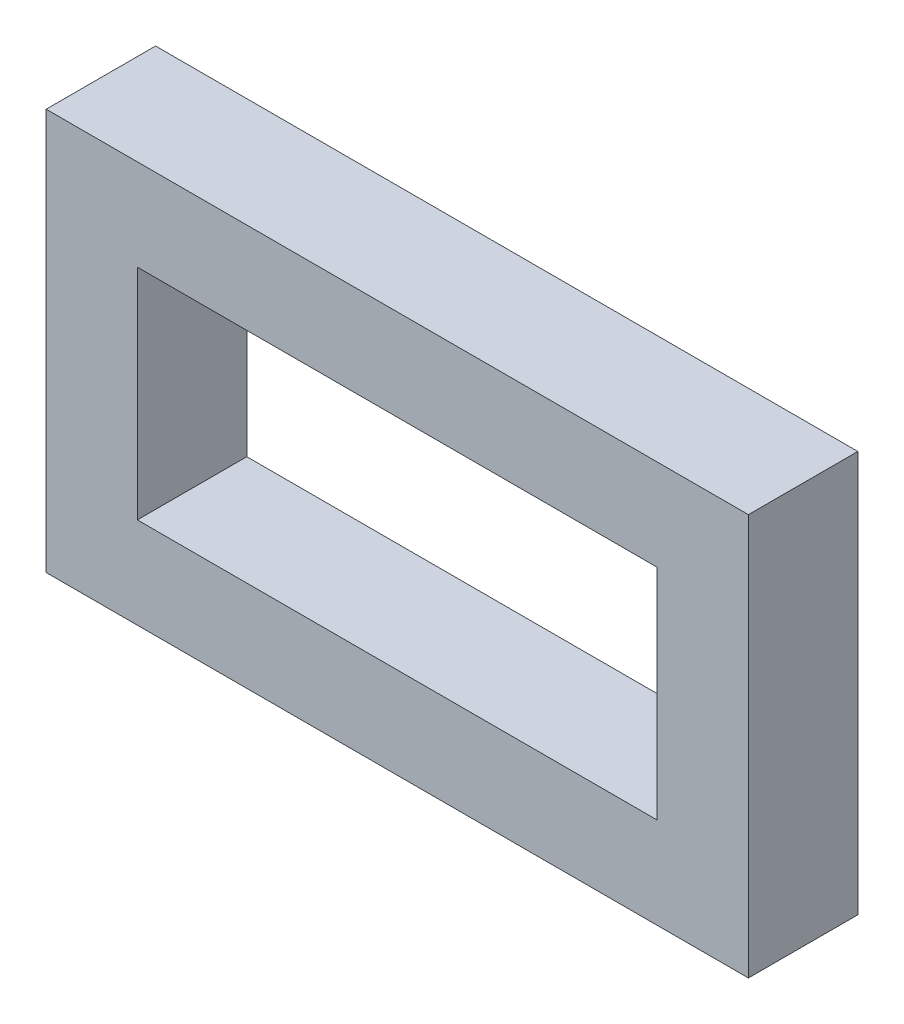
ISO-10303-21;
HEADER;
FILE_DESCRIPTION(('STEP AP214'),'2;1');
FILE_NAME('part.step','',(''),(''),'','','');
FILE_SCHEMA(('AUTOMOTIVE_DESIGN { 1 0 10303 214 1 1 1 1 }'));
ENDSEC;
DATA;
#1=APPLICATION_CONTEXT('core data for automotive mechanical design processes');
#2=APPLICATION_PROTOCOL_DEFINITION('international standard','automotive_design',2000,#1);
#3=PRODUCT_CONTEXT('',#1,'mechanical');
#4=PRODUCT('Part','Part','',(#3));
#5=PRODUCT_RELATED_PRODUCT_CATEGORY('part','',(#4));
#6=PRODUCT_DEFINITION_FORMATION('','',#4);
#7=PRODUCT_DEFINITION_CONTEXT('part definition',#1,'design');
#8=PRODUCT_DEFINITION('design','',#6,#7);
#9=PRODUCT_DEFINITION_SHAPE('','',#8);
#10=(LENGTH_UNIT() NAMED_UNIT(*) SI_UNIT(.MILLI.,.METRE.));
#11=(NAMED_UNIT(*) PLANE_ANGLE_UNIT() SI_UNIT($,.RADIAN.));
#12=(NAMED_UNIT(*) SI_UNIT($,.STERADIAN.) SOLID_ANGLE_UNIT());
#13=UNCERTAINTY_MEASURE_WITH_UNIT(LENGTH_MEASURE(1.E-05),#10,'distance_accuracy_value','');
#14=(GEOMETRIC_REPRESENTATION_CONTEXT(3) GLOBAL_UNCERTAINTY_ASSIGNED_CONTEXT((#13)) GLOBAL_UNIT_ASSIGNED_CONTEXT((#10,
#11,#12)) REPRESENTATION_CONTEXT('',''));
#15=CARTESIAN_POINT('',(0.,0.,0.));
#16=DIRECTION('',(0.,0.,1.));
#17=DIRECTION('',(1.,0.,0.));
#18=AXIS2_PLACEMENT_3D('',#15,#16,#17);
#19=CARTESIAN_POINT('',(0.,0.,6.));
#20=DIRECTION('',(0.,0.,1.));
#21=DIRECTION('',(1.,0.,0.));
#22=AXIS2_PLACEMENT_3D('',#19,#20,#21);
#23=PLANE('',#22);
#24=DIRECTION('',(0.,1.,0.));
#25=VECTOR('',#24,1.);
#26=CARTESIAN_POINT('',(19.25,11.,6.));
#27=LINE('',#26,#25);
#28=CARTESIAN_POINT('',(19.25,-11.,6.));
#29=VERTEX_POINT('',#28);
#30=CARTESIAN_POINT('',(19.25,11.,6.));
#31=VERTEX_POINT('',#30);
#32=EDGE_CURVE('E134',#29,#31,#27,.T.);
#33=ORIENTED_EDGE('',*,*,#32,.T.);
#34=DIRECTION('',(-1.,0.,0.));
#35=VECTOR('',#34,1.);
#36=CARTESIAN_POINT('',(-19.25,11.,6.));
#37=LINE('',#36,#35);
#38=CARTESIAN_POINT('',(-19.25,11.,6.));
#39=VERTEX_POINT('',#38);
#40=EDGE_CURVE('E137',#31,#39,#37,.T.);
#41=ORIENTED_EDGE('',*,*,#40,.T.);
#42=DIRECTION('',(0.,-1.,0.));
#43=VECTOR('',#42,1.);
#44=CARTESIAN_POINT('',(-19.25,11.,6.));
#45=LINE('',#44,#43);
#46=CARTESIAN_POINT('',(-19.25,-11.,6.));
#47=VERTEX_POINT('',#46);
#48=EDGE_CURVE('E140',#39,#47,#45,.T.);
#49=ORIENTED_EDGE('',*,*,#48,.T.);
#50=DIRECTION('',(1.,0.,0.));
#51=VECTOR('',#50,1.);
#52=CARTESIAN_POINT('',(-19.25,-11.,6.));
#53=LINE('',#52,#51);
#54=EDGE_CURVE('E142',#47,#29,#53,.T.);
#55=ORIENTED_EDGE('',*,*,#54,.T.);
#56=EDGE_LOOP('',(#33,#41,#49,#55));
#57=FACE_BOUND('',#56,.T.);
#58=DIRECTION('',(-1.,0.,0.));
#59=VECTOR('',#58,1.);
#60=CARTESIAN_POINT('',(-14.25,6.,6.));
#61=LINE('',#60,#59);
#62=CARTESIAN_POINT('',(14.25,6.,6.));
#63=VERTEX_POINT('',#62);
#64=CARTESIAN_POINT('',(-14.25,6.,6.));
#65=VERTEX_POINT('',#64);
#66=EDGE_CURVE('E106',#63,#65,#61,.T.);
#67=ORIENTED_EDGE('',*,*,#66,.F.);
#68=DIRECTION('',(0.,1.,0.));
#69=VECTOR('',#68,1.);
#70=CARTESIAN_POINT('',(14.25,6.,6.));
#71=LINE('',#70,#69);
#72=CARTESIAN_POINT('',(14.25,-6.,6.));
#73=VERTEX_POINT('',#72);
#74=EDGE_CURVE('E98',#73,#63,#71,.T.);
#75=ORIENTED_EDGE('',*,*,#74,.F.);
#76=DIRECTION('',(1.,0.,0.));
#77=VECTOR('',#76,1.);
#78=CARTESIAN_POINT('',(-14.25,-6.00000000000001,6.));
#79=LINE('',#78,#77);
#80=CARTESIAN_POINT('',(-14.25,-6.00000000000001,6.));
#81=VERTEX_POINT('',#80);
#82=EDGE_CURVE('E120',#81,#73,#79,.T.);
#83=ORIENTED_EDGE('',*,*,#82,.F.);
#84=DIRECTION('',(0.,-1.,0.));
#85=VECTOR('',#84,1.);
#86=CARTESIAN_POINT('',(-14.25,6.,6.));
#87=LINE('',#86,#85);
#88=EDGE_CURVE('E118',#65,#81,#87,.T.);
#89=ORIENTED_EDGE('',*,*,#88,.F.);
#90=EDGE_LOOP('',(#67,#75,#83,#89));
#91=FACE_BOUND('',#90,.T.);
#92=ADVANCED_FACE('F33',(#57,#91),#23,.T.);
#93=CARTESIAN_POINT('',(0.,0.,0.));
#94=DIRECTION('',(0.,0.,1.));
#95=DIRECTION('',(1.,0.,0.));
#96=AXIS2_PLACEMENT_3D('',#93,#94,#95);
#97=PLANE('',#96);
#98=DIRECTION('',(0.,1.,0.));
#99=VECTOR('',#98,1.);
#100=CARTESIAN_POINT('',(19.25,11.,0.));
#101=LINE('',#100,#99);
#102=CARTESIAN_POINT('',(19.25,-11.,0.));
#103=VERTEX_POINT('',#102);
#104=CARTESIAN_POINT('',(19.25,11.,0.));
#105=VERTEX_POINT('',#104);
#106=EDGE_CURVE('E114',#103,#105,#101,.T.);
#107=ORIENTED_EDGE('',*,*,#106,.F.);
#108=DIRECTION('',(1.,0.,0.));
#109=VECTOR('',#108,1.);
#110=CARTESIAN_POINT('',(-19.25,-11.,0.));
#111=LINE('',#110,#109);
#112=CARTESIAN_POINT('',(-19.25,-11.,0.));
#113=VERTEX_POINT('',#112);
#114=EDGE_CURVE('E138',#113,#103,#111,.T.);
#115=ORIENTED_EDGE('',*,*,#114,.F.);
#116=DIRECTION('',(0.,-1.,0.));
#117=VECTOR('',#116,1.);
#118=CARTESIAN_POINT('',(-19.25,11.,0.));
#119=LINE('',#118,#117);
#120=CARTESIAN_POINT('',(-19.25,11.,0.));
#121=VERTEX_POINT('',#120);
#122=EDGE_CURVE('E149',#121,#113,#119,.T.);
#123=ORIENTED_EDGE('',*,*,#122,.F.);
#124=DIRECTION('',(-1.,0.,0.));
#125=VECTOR('',#124,1.);
#126=CARTESIAN_POINT('',(-19.25,11.,0.));
#127=LINE('',#126,#125);
#128=EDGE_CURVE('E147',#105,#121,#127,.T.);
#129=ORIENTED_EDGE('',*,*,#128,.F.);
#130=EDGE_LOOP('',(#107,#115,#123,#129));
#131=FACE_BOUND('',#130,.T.);
#132=DIRECTION('',(0.,1.,0.));
#133=VECTOR('',#132,1.);
#134=CARTESIAN_POINT('',(14.25,6.,0.));
#135=LINE('',#134,#133);
#136=CARTESIAN_POINT('',(14.25,-6.,0.));
#137=VERTEX_POINT('',#136);
#138=CARTESIAN_POINT('',(14.25,6.,0.));
#139=VERTEX_POINT('',#138);
#140=EDGE_CURVE('E56',#137,#139,#135,.T.);
#141=ORIENTED_EDGE('',*,*,#140,.T.);
#142=DIRECTION('',(-1.,0.,0.));
#143=VECTOR('',#142,1.);
#144=CARTESIAN_POINT('',(-14.25,6.,0.));
#145=LINE('',#144,#143);
#146=CARTESIAN_POINT('',(-14.25,6.,0.));
#147=VERTEX_POINT('',#146);
#148=EDGE_CURVE('E113',#139,#147,#145,.T.);
#149=ORIENTED_EDGE('',*,*,#148,.T.);
#150=DIRECTION('',(0.,-1.,0.));
#151=VECTOR('',#150,1.);
#152=CARTESIAN_POINT('',(-14.25,6.,0.));
#153=LINE('',#152,#151);
#154=CARTESIAN_POINT('',(-14.25,-6.00000000000001,0.));
#155=VERTEX_POINT('',#154);
#156=EDGE_CURVE('E126',#147,#155,#153,.T.);
#157=ORIENTED_EDGE('',*,*,#156,.T.);
#158=DIRECTION('',(1.,0.,0.));
#159=VECTOR('',#158,1.);
#160=CARTESIAN_POINT('',(-14.25,-6.00000000000001,0.));
#161=LINE('',#160,#159);
#162=EDGE_CURVE('E107',#155,#137,#161,.T.);
#163=ORIENTED_EDGE('',*,*,#162,.T.);
#164=EDGE_LOOP('',(#141,#149,#157,#163));
#165=FACE_BOUND('',#164,.T.);
#166=ADVANCED_FACE('F167',(#131,#165),#97,.F.);
#167=CARTESIAN_POINT('',(19.25,11.,6.));
#168=DIRECTION('',(-1.,0.,0.));
#169=DIRECTION('',(0.,-1.,0.));
#170=AXIS2_PLACEMENT_3D('',#167,#168,#169);
#171=PLANE('',#170);
#172=ORIENTED_EDGE('',*,*,#106,.T.);
#173=DIRECTION('',(0.,0.,-1.));
#174=VECTOR('',#173,1.);
#175=CARTESIAN_POINT('',(19.25,11.,6.));
#176=LINE('',#175,#174);
#177=EDGE_CURVE('E11',#31,#105,#176,.T.);
#178=ORIENTED_EDGE('',*,*,#177,.F.);
#179=ORIENTED_EDGE('',*,*,#32,.F.);
#180=DIRECTION('',(0.,0.,-1.));
#181=VECTOR('',#180,1.);
#182=CARTESIAN_POINT('',(19.25,-11.,6.));
#183=LINE('',#182,#181);
#184=EDGE_CURVE('E144',#29,#103,#183,.T.);
#185=ORIENTED_EDGE('',*,*,#184,.T.);
#186=EDGE_LOOP('',(#172,#178,#179,#185));
#187=FACE_BOUND('',#186,.T.);
#188=ADVANCED_FACE('F35',(#187),#171,.F.);
#189=CARTESIAN_POINT('',(-19.25,11.,6.));
#190=DIRECTION('',(0.,-1.,0.));
#191=DIRECTION('',(0.,0.,-1.));
#192=AXIS2_PLACEMENT_3D('',#189,#190,#191);
#193=PLANE('',#192);
#194=ORIENTED_EDGE('',*,*,#128,.T.);
#195=DIRECTION('',(0.,0.,-1.));
#196=VECTOR('',#195,1.);
#197=CARTESIAN_POINT('',(-19.25,11.,6.));
#198=LINE('',#197,#196);
#199=EDGE_CURVE('E41',#39,#121,#198,.T.);
#200=ORIENTED_EDGE('',*,*,#199,.F.);
#201=ORIENTED_EDGE('',*,*,#40,.F.);
#202=ORIENTED_EDGE('',*,*,#177,.T.);
#203=EDGE_LOOP('',(#194,#200,#201,#202));
#204=FACE_BOUND('',#203,.T.);
#205=ADVANCED_FACE('F177',(#204),#193,.F.);
#206=CARTESIAN_POINT('',(-19.25,11.,6.));
#207=DIRECTION('',(1.,0.,0.));
#208=DIRECTION('',(0.,1.,0.));
#209=AXIS2_PLACEMENT_3D('',#206,#207,#208);
#210=PLANE('',#209);
#211=ORIENTED_EDGE('',*,*,#122,.T.);
#212=DIRECTION('',(0.,0.,-1.));
#213=VECTOR('',#212,1.);
#214=CARTESIAN_POINT('',(-19.25,-11.,6.));
#215=LINE('',#214,#213);
#216=EDGE_CURVE('E154',#47,#113,#215,.T.);
#217=ORIENTED_EDGE('',*,*,#216,.F.);
#218=ORIENTED_EDGE('',*,*,#48,.F.);
#219=ORIENTED_EDGE('',*,*,#199,.T.);
#220=EDGE_LOOP('',(#211,#217,#218,#219));
#221=FACE_BOUND('',#220,.T.);
#222=ADVANCED_FACE('F161',(#221),#210,.F.);
#223=CARTESIAN_POINT('',(-19.25,-11.,6.));
#224=DIRECTION('',(0.,1.,0.));
#225=DIRECTION('',(0.,0.,1.));
#226=AXIS2_PLACEMENT_3D('',#223,#224,#225);
#227=PLANE('',#226);
#228=ORIENTED_EDGE('',*,*,#114,.T.);
#229=ORIENTED_EDGE('',*,*,#184,.F.);
#230=ORIENTED_EDGE('',*,*,#54,.F.);
#231=ORIENTED_EDGE('',*,*,#216,.T.);
#232=EDGE_LOOP('',(#228,#229,#230,#231));
#233=FACE_BOUND('',#232,.T.);
#234=ADVANCED_FACE('F171',(#233),#227,.F.);
#235=CARTESIAN_POINT('',(14.25,6.,6.));
#236=DIRECTION('',(-1.,0.,0.));
#237=DIRECTION('',(0.,0.,1.));
#238=AXIS2_PLACEMENT_3D('',#235,#236,#237);
#239=PLANE('',#238);
#240=ORIENTED_EDGE('',*,*,#140,.F.);
#241=DIRECTION('',(0.,0.,-1.));
#242=VECTOR('',#241,1.);
#243=CARTESIAN_POINT('',(14.25,-6.,6.));
#244=LINE('',#243,#242);
#245=EDGE_CURVE('E102',#73,#137,#244,.T.);
#246=ORIENTED_EDGE('',*,*,#245,.F.);
#247=ORIENTED_EDGE('',*,*,#74,.T.);
#248=DIRECTION('',(0.,0.,-1.));
#249=VECTOR('',#248,1.);
#250=CARTESIAN_POINT('',(14.25,6.,6.));
#251=LINE('',#250,#249);
#252=EDGE_CURVE('E101',#63,#139,#251,.T.);
#253=ORIENTED_EDGE('',*,*,#252,.T.);
#254=EDGE_LOOP('',(#240,#246,#247,#253));
#255=FACE_BOUND('',#254,.T.);
#256=ADVANCED_FACE('F100',(#255),#239,.T.);
#257=CARTESIAN_POINT('',(-14.25,6.,6.));
#258=DIRECTION('',(0.,-1.,0.));
#259=DIRECTION('',(0.,0.,-1.));
#260=AXIS2_PLACEMENT_3D('',#257,#258,#259);
#261=PLANE('',#260);
#262=ORIENTED_EDGE('',*,*,#148,.F.);
#263=ORIENTED_EDGE('',*,*,#252,.F.);
#264=ORIENTED_EDGE('',*,*,#66,.T.);
#265=DIRECTION('',(0.,0.,-1.));
#266=VECTOR('',#265,1.);
#267=CARTESIAN_POINT('',(-14.25,6.,6.));
#268=LINE('',#267,#266);
#269=EDGE_CURVE('E115',#65,#147,#268,.T.);
#270=ORIENTED_EDGE('',*,*,#269,.T.);
#271=EDGE_LOOP('',(#262,#263,#264,#270));
#272=FACE_BOUND('',#271,.T.);
#273=ADVANCED_FACE('F110',(#272),#261,.T.);
#274=CARTESIAN_POINT('',(-14.25,6.,6.));
#275=DIRECTION('',(1.,0.,0.));
#276=DIRECTION('',(0.,0.,-1.));
#277=AXIS2_PLACEMENT_3D('',#274,#275,#276);
#278=PLANE('',#277);
#279=ORIENTED_EDGE('',*,*,#156,.F.);
#280=ORIENTED_EDGE('',*,*,#269,.F.);
#281=ORIENTED_EDGE('',*,*,#88,.T.);
#282=DIRECTION('',(0.,0.,-1.));
#283=VECTOR('',#282,1.);
#284=CARTESIAN_POINT('',(-14.25,-6.00000000000001,6.));
#285=LINE('',#284,#283);
#286=EDGE_CURVE('E48',#81,#155,#285,.T.);
#287=ORIENTED_EDGE('',*,*,#286,.T.);
#288=EDGE_LOOP('',(#279,#280,#281,#287));
#289=FACE_BOUND('',#288,.T.);
#290=ADVANCED_FACE('F200',(#289),#278,.T.);
#291=CARTESIAN_POINT('',(-14.25,-6.00000000000001,6.));
#292=DIRECTION('',(0.,1.,0.));
#293=DIRECTION('',(-1.,0.,0.));
#294=AXIS2_PLACEMENT_3D('',#291,#292,#293);
#295=PLANE('',#294);
#296=ORIENTED_EDGE('',*,*,#162,.F.);
#297=ORIENTED_EDGE('',*,*,#286,.F.);
#298=ORIENTED_EDGE('',*,*,#82,.T.);
#299=ORIENTED_EDGE('',*,*,#245,.T.);
#300=EDGE_LOOP('',(#296,#297,#298,#299));
#301=FACE_BOUND('',#300,.T.);
#302=ADVANCED_FACE('F204',(#301),#295,.T.);
#303=CLOSED_SHELL('',(#92,#166,#188,#205,#222,#234,#256,#273,#290,#302));
#304=MANIFOLD_SOLID_BREP('B2',#303);
#305=ADVANCED_BREP_SHAPE_REPRESENTATION('',(#18,#304),#14);
#306=SHAPE_DEFINITION_REPRESENTATION(#9,#305);
ENDSEC;
END-ISO-10303-21;
